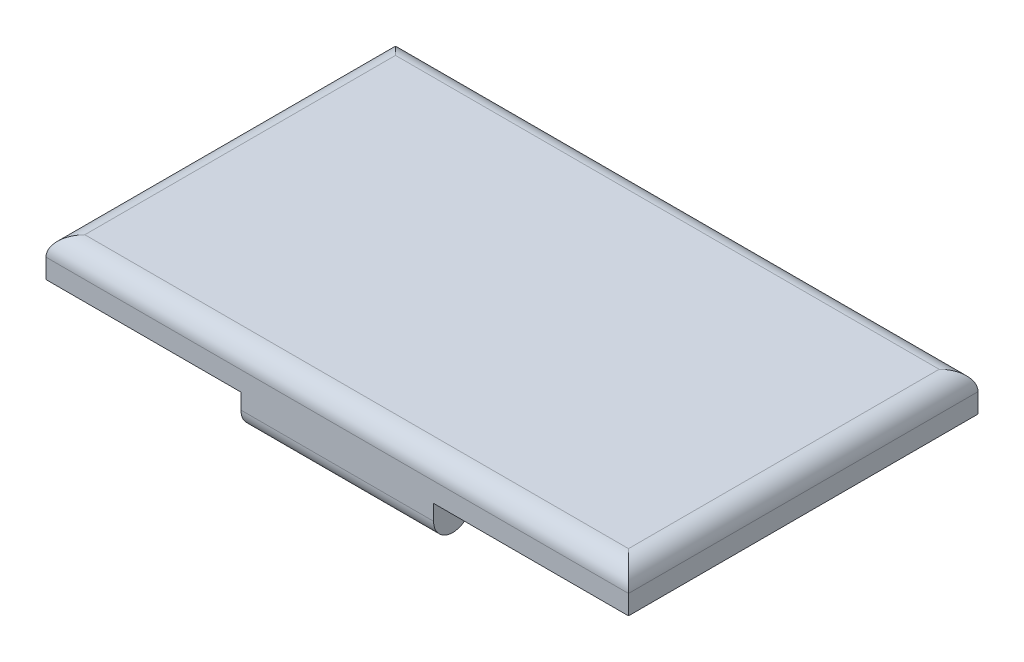
ISO-10303-21;
HEADER;
FILE_DESCRIPTION(('STEP AP214'),'2;1');
FILE_NAME('part.step','',(''),(''),'','','');
FILE_SCHEMA(('AUTOMOTIVE_DESIGN { 1 0 10303 214 1 1 1 1 }'));
ENDSEC;
DATA;
#1=APPLICATION_CONTEXT('core data for automotive mechanical design processes');
#2=APPLICATION_PROTOCOL_DEFINITION('international standard','automotive_design',2000,#1);
#3=PRODUCT_CONTEXT('',#1,'mechanical');
#4=PRODUCT('Part','Part','',(#3));
#5=PRODUCT_RELATED_PRODUCT_CATEGORY('part','',(#4));
#6=PRODUCT_DEFINITION_FORMATION('','',#4);
#7=PRODUCT_DEFINITION_CONTEXT('part definition',#1,'design');
#8=PRODUCT_DEFINITION('design','',#6,#7);
#9=PRODUCT_DEFINITION_SHAPE('','',#8);
#10=(LENGTH_UNIT() NAMED_UNIT(*) SI_UNIT(.MILLI.,.METRE.));
#11=(NAMED_UNIT(*) PLANE_ANGLE_UNIT() SI_UNIT($,.RADIAN.));
#12=(NAMED_UNIT(*) SI_UNIT($,.STERADIAN.) SOLID_ANGLE_UNIT());
#13=UNCERTAINTY_MEASURE_WITH_UNIT(LENGTH_MEASURE(1.E-05),#10,'distance_accuracy_value','');
#14=(GEOMETRIC_REPRESENTATION_CONTEXT(3) GLOBAL_UNCERTAINTY_ASSIGNED_CONTEXT((#13)) GLOBAL_UNIT_ASSIGNED_CONTEXT((#10,
#11,#12)) REPRESENTATION_CONTEXT('',''));
#15=CARTESIAN_POINT('',(0.,0.,0.));
#16=DIRECTION('',(0.,0.,1.));
#17=DIRECTION('',(1.,0.,0.));
#18=AXIS2_PLACEMENT_3D('',#15,#16,#17);
#19=CARTESIAN_POINT('',(0.,0.,0.));
#20=DIRECTION('',(0.,-1.,0.));
#21=DIRECTION('',(0.,0.,-1.));
#22=AXIS2_PLACEMENT_3D('',#19,#20,#21);
#23=PLANE('',#22);
#24=DIRECTION('',(0.,0.,-1.));
#25=VECTOR('',#24,1.);
#26=CARTESIAN_POINT('',(6.,0.,-74.));
#27=LINE('',#26,#25);
#28=CARTESIAN_POINT('',(6.,0.,-16.));
#29=VERTEX_POINT('',#28);
#30=CARTESIAN_POINT('',(6.,0.,-74.));
#31=VERTEX_POINT('',#30);
#32=EDGE_CURVE('E181',#29,#31,#27,.T.);
#33=ORIENTED_EDGE('',*,*,#32,.F.);
#34=DIRECTION('',(-1.,0.,0.));
#35=VECTOR('',#34,1.);
#36=CARTESIAN_POINT('',(6.,0.,-16.));
#37=LINE('',#36,#35);
#38=CARTESIAN_POINT('',(144.,0.,-16.));
#39=VERTEX_POINT('',#38);
#40=EDGE_CURVE('E198',#39,#29,#37,.T.);
#41=ORIENTED_EDGE('',*,*,#40,.F.);
#42=DIRECTION('',(0.,0.,1.));
#43=VECTOR('',#42,1.);
#44=CARTESIAN_POINT('',(144.,0.,-16.));
#45=LINE('',#44,#43);
#46=CARTESIAN_POINT('',(144.,0.,-74.));
#47=VERTEX_POINT('',#46);
#48=EDGE_CURVE('E201',#47,#39,#45,.T.);
#49=ORIENTED_EDGE('',*,*,#48,.F.);
#50=DIRECTION('',(1.,0.,0.));
#51=VECTOR('',#50,1.);
#52=CARTESIAN_POINT('',(144.,0.,-74.));
#53=LINE('',#52,#51);
#54=EDGE_CURVE('E207',#31,#47,#53,.T.);
#55=ORIENTED_EDGE('',*,*,#54,.F.);
#56=EDGE_LOOP('',(#33,#41,#49,#55));
#57=FACE_BOUND('',#56,.T.);
#58=DIRECTION('',(-1.,0.,0.));
#59=VECTOR('',#58,1.);
#60=CARTESIAN_POINT('',(50.2,0.,-80.1));
#61=LINE('',#60,#59);
#62=CARTESIAN_POINT('',(99.8,0.,-80.1));
#63=VERTEX_POINT('',#62);
#64=CARTESIAN_POINT('',(50.2,0.,-80.1));
#65=VERTEX_POINT('',#64);
#66=EDGE_CURVE('E220',#63,#65,#61,.T.);
#67=ORIENTED_EDGE('',*,*,#66,.F.);
#68=DIRECTION('',(0.,0.,1.));
#69=VECTOR('',#68,1.);
#70=CARTESIAN_POINT('',(99.8,0.,-90.));
#71=LINE('',#70,#69);
#72=CARTESIAN_POINT('',(99.8,0.,-90.));
#73=VERTEX_POINT('',#72);
#74=EDGE_CURVE('E214',#73,#63,#71,.T.);
#75=ORIENTED_EDGE('',*,*,#74,.F.);
#76=DIRECTION('',(-1.,0.,0.));
#77=VECTOR('',#76,1.);
#78=CARTESIAN_POINT('',(0.,0.,-90.));
#79=LINE('',#78,#77);
#80=CARTESIAN_POINT('',(150.,0.,-90.));
#81=VERTEX_POINT('',#80);
#82=EDGE_CURVE('E322',#81,#73,#79,.T.);
#83=ORIENTED_EDGE('',*,*,#82,.F.);
#84=DIRECTION('',(0.,0.,-1.));
#85=VECTOR('',#84,1.);
#86=CARTESIAN_POINT('',(150.,0.,0.));
#87=LINE('',#86,#85);
#88=CARTESIAN_POINT('',(150.,0.,0.));
#89=VERTEX_POINT('',#88);
#90=EDGE_CURVE('E336',#89,#81,#87,.T.);
#91=ORIENTED_EDGE('',*,*,#90,.F.);
#92=DIRECTION('',(1.,0.,0.));
#93=VECTOR('',#92,1.);
#94=CARTESIAN_POINT('',(0.,0.,0.));
#95=LINE('',#94,#93);
#96=CARTESIAN_POINT('',(99.8,0.,0.));
#97=VERTEX_POINT('',#96);
#98=EDGE_CURVE('E337',#97,#89,#95,.T.);
#99=ORIENTED_EDGE('',*,*,#98,.F.);
#100=DIRECTION('',(0.,0.,1.));
#101=VECTOR('',#100,1.);
#102=CARTESIAN_POINT('',(99.8,0.,0.));
#103=LINE('',#102,#101);
#104=CARTESIAN_POINT('',(99.8,0.,-9.9));
#105=VERTEX_POINT('',#104);
#106=EDGE_CURVE('E238',#105,#97,#103,.T.);
#107=ORIENTED_EDGE('',*,*,#106,.F.);
#108=DIRECTION('',(1.,0.,0.));
#109=VECTOR('',#108,1.);
#110=CARTESIAN_POINT('',(50.2,0.,-9.90000000000002));
#111=LINE('',#110,#109);
#112=CARTESIAN_POINT('',(50.2,0.,-9.90000000000002));
#113=VERTEX_POINT('',#112);
#114=EDGE_CURVE('E235',#113,#105,#111,.T.);
#115=ORIENTED_EDGE('',*,*,#114,.F.);
#116=DIRECTION('',(0.,0.,-1.));
#117=VECTOR('',#116,1.);
#118=CARTESIAN_POINT('',(50.2,0.,0.));
#119=LINE('',#118,#117);
#120=CARTESIAN_POINT('',(50.2,0.,0.));
#121=VERTEX_POINT('',#120);
#122=EDGE_CURVE('E234',#121,#113,#119,.T.);
#123=ORIENTED_EDGE('',*,*,#122,.F.);
#124=CARTESIAN_POINT('',(0.,0.,0.));
#125=VERTEX_POINT('',#124);
#126=EDGE_CURVE('E332',#125,#121,#95,.T.);
#127=ORIENTED_EDGE('',*,*,#126,.F.);
#128=DIRECTION('',(0.,0.,1.));
#129=VECTOR('',#128,1.);
#130=CARTESIAN_POINT('',(0.,0.,0.));
#131=LINE('',#130,#129);
#132=CARTESIAN_POINT('',(0.,0.,-90.));
#133=VERTEX_POINT('',#132);
#134=EDGE_CURVE('E341',#133,#125,#131,.T.);
#135=ORIENTED_EDGE('',*,*,#134,.F.);
#136=CARTESIAN_POINT('',(50.2,0.,-90.));
#137=VERTEX_POINT('',#136);
#138=EDGE_CURVE('E319',#137,#133,#79,.T.);
#139=ORIENTED_EDGE('',*,*,#138,.F.);
#140=DIRECTION('',(0.,0.,-1.));
#141=VECTOR('',#140,1.);
#142=CARTESIAN_POINT('',(50.2,0.,-90.));
#143=LINE('',#142,#141);
#144=EDGE_CURVE('E223',#65,#137,#143,.T.);
#145=ORIENTED_EDGE('',*,*,#144,.F.);
#146=EDGE_LOOP('',(#67,#75,#83,#91,#99,#107,#115,#123,#127,#135,#139,#145));
#147=FACE_BOUND('',#146,.T.);
#148=ADVANCED_FACE('F33',(#57,#147),#23,.T.);
#149=CARTESIAN_POINT('',(0.,10.,0.));
#150=DIRECTION('',(1.,0.,0.));
#151=DIRECTION('',(0.,0.,-1.));
#152=AXIS2_PLACEMENT_3D('',#149,#150,#151);
#153=PLANE('',#152);
#154=DIRECTION('',(0.,-1.,0.));
#155=VECTOR('',#154,1.);
#156=CARTESIAN_POINT('',(0.,10.,0.));
#157=LINE('',#156,#155);
#158=CARTESIAN_POINT('',(0.,5.,0.));
#159=VERTEX_POINT('',#158);
#160=EDGE_CURVE('E312',#159,#125,#157,.T.);
#161=ORIENTED_EDGE('',*,*,#160,.F.);
#162=DIRECTION('',(0.,0.,1.));
#163=VECTOR('',#162,1.);
#164=CARTESIAN_POINT('',(0.,5.,0.));
#165=LINE('',#164,#163);
#166=CARTESIAN_POINT('',(0.,5.,-90.));
#167=VERTEX_POINT('',#166);
#168=EDGE_CURVE('E11',#159,#167,#165,.F.);
#169=ORIENTED_EDGE('',*,*,#168,.T.);
#170=DIRECTION('',(0.,-1.,0.));
#171=VECTOR('',#170,1.);
#172=CARTESIAN_POINT('',(0.,10.,-90.));
#173=LINE('',#172,#171);
#174=EDGE_CURVE('E310',#167,#133,#173,.T.);
#175=ORIENTED_EDGE('',*,*,#174,.T.);
#176=ORIENTED_EDGE('',*,*,#134,.T.);
#177=EDGE_LOOP('',(#161,#169,#175,#176));
#178=FACE_BOUND('',#177,.T.);
#179=ADVANCED_FACE('F308',(#178),#153,.F.);
#180=CARTESIAN_POINT('',(0.,10.,0.));
#181=DIRECTION('',(0.,0.,-1.));
#182=DIRECTION('',(-1.,0.,0.));
#183=AXIS2_PLACEMENT_3D('',#180,#181,#182);
#184=PLANE('',#183);
#185=DIRECTION('',(0.,1.,0.));
#186=VECTOR('',#185,1.);
#187=CARTESIAN_POINT('',(50.2,-9.,0.));
#188=LINE('',#187,#186);
#189=CARTESIAN_POINT('',(50.2,-4.,0.));
#190=VERTEX_POINT('',#189);
#191=EDGE_CURVE('E247',#190,#121,#188,.T.);
#192=ORIENTED_EDGE('',*,*,#191,.F.);
#193=DIRECTION('',(-1.,0.,0.));
#194=VECTOR('',#193,1.);
#195=CARTESIAN_POINT('',(99.8,-4.,0.));
#196=LINE('',#195,#194);
#197=CARTESIAN_POINT('',(99.8,-4.,0.));
#198=VERTEX_POINT('',#197);
#199=EDGE_CURVE('E274',#190,#198,#196,.F.);
#200=ORIENTED_EDGE('',*,*,#199,.T.);
#201=DIRECTION('',(0.,1.,0.));
#202=VECTOR('',#201,1.);
#203=CARTESIAN_POINT('',(99.8,-9.,0.));
#204=LINE('',#203,#202);
#205=EDGE_CURVE('E255',#198,#97,#204,.T.);
#206=ORIENTED_EDGE('',*,*,#205,.T.);
#207=ORIENTED_EDGE('',*,*,#98,.T.);
#208=DIRECTION('',(0.,-1.,0.));
#209=VECTOR('',#208,1.);
#210=CARTESIAN_POINT('',(150.,10.,0.));
#211=LINE('',#210,#209);
#212=CARTESIAN_POINT('',(150.,5.,0.));
#213=VERTEX_POINT('',#212);
#214=EDGE_CURVE('E324',#213,#89,#211,.T.);
#215=ORIENTED_EDGE('',*,*,#214,.F.);
#216=DIRECTION('',(1.,0.,0.));
#217=VECTOR('',#216,1.);
#218=CARTESIAN_POINT('',(0.,5.,0.));
#219=LINE('',#218,#217);
#220=EDGE_CURVE('E272',#213,#159,#219,.F.);
#221=ORIENTED_EDGE('',*,*,#220,.T.);
#222=ORIENTED_EDGE('',*,*,#160,.T.);
#223=ORIENTED_EDGE('',*,*,#126,.T.);
#224=EDGE_LOOP('',(#192,#200,#206,#207,#215,#221,#222,#223));
#225=FACE_BOUND('',#224,.T.);
#226=ADVANCED_FACE('F414',(#225),#184,.F.);
#227=CARTESIAN_POINT('',(150.,10.,0.));
#228=DIRECTION('',(-1.,0.,0.));
#229=DIRECTION('',(0.,0.,1.));
#230=AXIS2_PLACEMENT_3D('',#227,#228,#229);
#231=PLANE('',#230);
#232=DIRECTION('',(0.,-1.,0.));
#233=VECTOR('',#232,1.);
#234=CARTESIAN_POINT('',(150.,10.,-90.));
#235=LINE('',#234,#233);
#236=CARTESIAN_POINT('',(150.,5.,-90.));
#237=VERTEX_POINT('',#236);
#238=EDGE_CURVE('E321',#237,#81,#235,.T.);
#239=ORIENTED_EDGE('',*,*,#238,.F.);
#240=DIRECTION('',(0.,0.,-1.));
#241=VECTOR('',#240,1.);
#242=CARTESIAN_POINT('',(150.,5.,0.));
#243=LINE('',#242,#241);
#244=EDGE_CURVE('E42',#237,#213,#243,.F.);
#245=ORIENTED_EDGE('',*,*,#244,.T.);
#246=ORIENTED_EDGE('',*,*,#214,.T.);
#247=ORIENTED_EDGE('',*,*,#90,.T.);
#248=EDGE_LOOP('',(#239,#245,#246,#247));
#249=FACE_BOUND('',#248,.T.);
#250=ADVANCED_FACE('F347',(#249),#231,.F.);
#251=CARTESIAN_POINT('',(0.,10.,-90.));
#252=DIRECTION('',(0.,0.,1.));
#253=DIRECTION('',(1.,0.,0.));
#254=AXIS2_PLACEMENT_3D('',#251,#252,#253);
#255=PLANE('',#254);
#256=DIRECTION('',(0.,1.,0.));
#257=VECTOR('',#256,1.);
#258=CARTESIAN_POINT('',(99.8,-9.,-90.));
#259=LINE('',#258,#257);
#260=CARTESIAN_POINT('',(99.8,-4.,-90.));
#261=VERTEX_POINT('',#260);
#262=EDGE_CURVE('E232',#261,#73,#259,.T.);
#263=ORIENTED_EDGE('',*,*,#262,.F.);
#264=DIRECTION('',(1.,0.,0.));
#265=VECTOR('',#264,1.);
#266=CARTESIAN_POINT('',(50.2,-4.,-90.));
#267=LINE('',#266,#265);
#268=CARTESIAN_POINT('',(50.2,-4.,-90.));
#269=VERTEX_POINT('',#268);
#270=EDGE_CURVE('E258',#261,#269,#267,.F.);
#271=ORIENTED_EDGE('',*,*,#270,.T.);
#272=DIRECTION('',(0.,1.,0.));
#273=VECTOR('',#272,1.);
#274=CARTESIAN_POINT('',(50.2,-9.,-90.));
#275=LINE('',#274,#273);
#276=EDGE_CURVE('E226',#269,#137,#275,.T.);
#277=ORIENTED_EDGE('',*,*,#276,.T.);
#278=ORIENTED_EDGE('',*,*,#138,.T.);
#279=ORIENTED_EDGE('',*,*,#174,.F.);
#280=DIRECTION('',(-1.,0.,0.));
#281=VECTOR('',#280,1.);
#282=CARTESIAN_POINT('',(0.,5.,-90.));
#283=LINE('',#282,#281);
#284=EDGE_CURVE('E316',#167,#237,#283,.F.);
#285=ORIENTED_EDGE('',*,*,#284,.T.);
#286=ORIENTED_EDGE('',*,*,#238,.T.);
#287=ORIENTED_EDGE('',*,*,#82,.T.);
#288=EDGE_LOOP('',(#263,#271,#277,#278,#279,#285,#286,#287));
#289=FACE_BOUND('',#288,.T.);
#290=ADVANCED_FACE('F315',(#289),#255,.F.);
#291=CARTESIAN_POINT('',(0.,10.,0.));
#292=DIRECTION('',(0.,-1.,0.));
#293=DIRECTION('',(0.,0.,-1.));
#294=AXIS2_PLACEMENT_3D('',#291,#292,#293);
#295=PLANE('',#294);
#296=DIRECTION('',(1.,0.,0.));
#297=VECTOR('',#296,1.);
#298=CARTESIAN_POINT('',(0.,10.,-5.));
#299=LINE('',#298,#297);
#300=CARTESIAN_POINT('',(5.,10.,-5.));
#301=VERTEX_POINT('',#300);
#302=CARTESIAN_POINT('',(145.,10.,-5.));
#303=VERTEX_POINT('',#302);
#304=EDGE_CURVE('E58',#301,#303,#299,.T.);
#305=ORIENTED_EDGE('',*,*,#304,.T.);
#306=DIRECTION('',(0.,0.,-1.));
#307=VECTOR('',#306,1.);
#308=CARTESIAN_POINT('',(145.,10.,0.));
#309=LINE('',#308,#307);
#310=CARTESIAN_POINT('',(145.,10.,-85.));
#311=VERTEX_POINT('',#310);
#312=EDGE_CURVE('E281',#303,#311,#309,.T.);
#313=ORIENTED_EDGE('',*,*,#312,.T.);
#314=DIRECTION('',(-1.,0.,0.));
#315=VECTOR('',#314,1.);
#316=CARTESIAN_POINT('',(0.,10.,-85.));
#317=LINE('',#316,#315);
#318=CARTESIAN_POINT('',(5.,10.,-85.));
#319=VERTEX_POINT('',#318);
#320=EDGE_CURVE('E279',#311,#319,#317,.T.);
#321=ORIENTED_EDGE('',*,*,#320,.T.);
#322=DIRECTION('',(0.,0.,1.));
#323=VECTOR('',#322,1.);
#324=CARTESIAN_POINT('',(5.,10.,0.));
#325=LINE('',#324,#323);
#326=EDGE_CURVE('E276',#319,#301,#325,.T.);
#327=ORIENTED_EDGE('',*,*,#326,.T.);
#328=EDGE_LOOP('',(#305,#313,#321,#327));
#329=FACE_BOUND('',#328,.T.);
#330=ADVANCED_FACE('F405',(#329),#295,.F.);
#331=CARTESIAN_POINT('',(50.2,-9.,0.));
#332=DIRECTION('',(1.,0.,0.));
#333=DIRECTION('',(0.,0.,-1.));
#334=AXIS2_PLACEMENT_3D('',#331,#332,#333);
#335=PLANE('',#334);
#336=DIRECTION('',(0.,1.,0.));
#337=VECTOR('',#336,1.);
#338=CARTESIAN_POINT('',(50.2,-9.,-9.90000000000002));
#339=LINE('',#338,#337);
#340=CARTESIAN_POINT('',(50.2,-4.,-9.90000000000002));
#341=VERTEX_POINT('',#340);
#342=EDGE_CURVE('E384',#341,#113,#339,.T.);
#343=ORIENTED_EDGE('',*,*,#342,.F.);
#344=CARTESIAN_POINT('',(50.2,-4.,-4.90000000000002));
#345=DIRECTION('',(1.,0.,0.));
#346=DIRECTION('',(0.,0.,-1.));
#347=AXIS2_PLACEMENT_3D('',#344,#345,#346);
#348=CIRCLE('',#347,5.);
#349=CARTESIAN_POINT('',(50.2,-8.99974999374969,-4.95000000000001));
#350=VERTEX_POINT('',#349);
#351=EDGE_CURVE('E270',#341,#350,#348,.F.);
#352=ORIENTED_EDGE('',*,*,#351,.T.);
#353=CARTESIAN_POINT('',(50.2,-4.,-5.));
#354=DIRECTION('',(1.,0.,0.));
#355=DIRECTION('',(0.,0.,-1.));
#356=AXIS2_PLACEMENT_3D('',#353,#354,#355);
#357=CIRCLE('',#356,5.);
#358=EDGE_CURVE('E267',#350,#190,#357,.F.);
#359=ORIENTED_EDGE('',*,*,#358,.T.);
#360=ORIENTED_EDGE('',*,*,#191,.T.);
#361=ORIENTED_EDGE('',*,*,#122,.T.);
#362=EDGE_LOOP('',(#343,#352,#359,#360,#361));
#363=FACE_BOUND('',#362,.T.);
#364=ADVANCED_FACE('F398',(#363),#335,.F.);
#365=CARTESIAN_POINT('',(50.2,-9.,-9.90000000000002));
#366=DIRECTION('',(0.,0.,1.));
#367=DIRECTION('',(1.,0.,0.));
#368=AXIS2_PLACEMENT_3D('',#365,#366,#367);
#369=PLANE('',#368);
#370=DIRECTION('',(0.,1.,0.));
#371=VECTOR('',#370,1.);
#372=CARTESIAN_POINT('',(99.8,-9.,-9.9));
#373=LINE('',#372,#371);
#374=CARTESIAN_POINT('',(99.8,-4.,-9.9));
#375=VERTEX_POINT('',#374);
#376=EDGE_CURVE('E241',#375,#105,#373,.T.);
#377=ORIENTED_EDGE('',*,*,#376,.F.);
#378=DIRECTION('',(1.,0.,0.));
#379=VECTOR('',#378,1.);
#380=CARTESIAN_POINT('',(50.2,-4.,-9.90000000000002));
#381=LINE('',#380,#379);
#382=EDGE_CURVE('E264',#375,#341,#381,.F.);
#383=ORIENTED_EDGE('',*,*,#382,.T.);
#384=ORIENTED_EDGE('',*,*,#342,.T.);
#385=ORIENTED_EDGE('',*,*,#114,.T.);
#386=EDGE_LOOP('',(#377,#383,#384,#385));
#387=FACE_BOUND('',#386,.T.);
#388=ADVANCED_FACE('F396',(#387),#369,.F.);
#389=CARTESIAN_POINT('',(99.8,-9.,0.));
#390=DIRECTION('',(-1.,0.,0.));
#391=DIRECTION('',(0.,0.,1.));
#392=AXIS2_PLACEMENT_3D('',#389,#390,#391);
#393=PLANE('',#392);
#394=CARTESIAN_POINT('',(99.8,-4.,-5.));
#395=DIRECTION('',(-1.,0.,0.));
#396=DIRECTION('',(0.,0.,1.));
#397=AXIS2_PLACEMENT_3D('',#394,#395,#396);
#398=CIRCLE('',#397,5.);
#399=CARTESIAN_POINT('',(99.8,-8.99974999374969,-4.95));
#400=VERTEX_POINT('',#399);
#401=EDGE_CURVE('E260',#198,#400,#398,.F.);
#402=ORIENTED_EDGE('',*,*,#401,.T.);
#403=CARTESIAN_POINT('',(99.8,-4.,-4.9));
#404=DIRECTION('',(-1.,0.,0.));
#405=DIRECTION('',(0.,0.,1.));
#406=AXIS2_PLACEMENT_3D('',#403,#404,#405);
#407=CIRCLE('',#406,5.);
#408=EDGE_CURVE('E262',#400,#375,#407,.F.);
#409=ORIENTED_EDGE('',*,*,#408,.T.);
#410=ORIENTED_EDGE('',*,*,#376,.T.);
#411=ORIENTED_EDGE('',*,*,#106,.T.);
#412=ORIENTED_EDGE('',*,*,#205,.F.);
#413=EDGE_LOOP('',(#402,#409,#410,#411,#412));
#414=FACE_BOUND('',#413,.T.);
#415=ADVANCED_FACE('F391',(#414),#393,.F.);
#416=CARTESIAN_POINT('',(99.8,-9.,-90.));
#417=DIRECTION('',(-1.,0.,0.));
#418=DIRECTION('',(0.,0.,1.));
#419=AXIS2_PLACEMENT_3D('',#416,#417,#418);
#420=PLANE('',#419);
#421=DIRECTION('',(0.,1.,0.));
#422=VECTOR('',#421,1.);
#423=CARTESIAN_POINT('',(99.8,-9.,-80.1));
#424=LINE('',#423,#422);
#425=CARTESIAN_POINT('',(99.8,-4.,-80.1));
#426=VERTEX_POINT('',#425);
#427=EDGE_CURVE('E230',#426,#63,#424,.T.);
#428=ORIENTED_EDGE('',*,*,#427,.F.);
#429=CARTESIAN_POINT('',(99.8,-4.,-85.1));
#430=DIRECTION('',(-1.,0.,0.));
#431=DIRECTION('',(0.,0.,1.));
#432=AXIS2_PLACEMENT_3D('',#429,#430,#431);
#433=CIRCLE('',#432,5.);
#434=CARTESIAN_POINT('',(99.8,-8.99974999374969,-85.05));
#435=VERTEX_POINT('',#434);
#436=EDGE_CURVE('E363',#426,#435,#433,.F.);
#437=ORIENTED_EDGE('',*,*,#436,.T.);
#438=CARTESIAN_POINT('',(99.8,-4.,-85.));
#439=DIRECTION('',(-1.,0.,0.));
#440=DIRECTION('',(0.,0.,1.));
#441=AXIS2_PLACEMENT_3D('',#438,#439,#440);
#442=CIRCLE('',#441,5.);
#443=EDGE_CURVE('E362',#435,#261,#442,.F.);
#444=ORIENTED_EDGE('',*,*,#443,.T.);
#445=ORIENTED_EDGE('',*,*,#262,.T.);
#446=ORIENTED_EDGE('',*,*,#74,.T.);
#447=EDGE_LOOP('',(#428,#437,#444,#445,#446));
#448=FACE_BOUND('',#447,.T.);
#449=ADVANCED_FACE('F380',(#448),#420,.F.);
#450=CARTESIAN_POINT('',(50.2,-9.,-80.1));
#451=DIRECTION('',(0.,0.,-1.));
#452=DIRECTION('',(-1.,0.,0.));
#453=AXIS2_PLACEMENT_3D('',#450,#451,#452);
#454=PLANE('',#453);
#455=DIRECTION('',(0.,1.,0.));
#456=VECTOR('',#455,1.);
#457=CARTESIAN_POINT('',(50.2,-9.,-80.1));
#458=LINE('',#457,#456);
#459=CARTESIAN_POINT('',(50.2,-4.,-80.1));
#460=VERTEX_POINT('',#459);
#461=EDGE_CURVE('E228',#460,#65,#458,.T.);
#462=ORIENTED_EDGE('',*,*,#461,.F.);
#463=DIRECTION('',(-1.,0.,0.));
#464=VECTOR('',#463,1.);
#465=CARTESIAN_POINT('',(99.8,-4.,-80.1));
#466=LINE('',#465,#464);
#467=EDGE_CURVE('E367',#460,#426,#466,.F.);
#468=ORIENTED_EDGE('',*,*,#467,.T.);
#469=ORIENTED_EDGE('',*,*,#427,.T.);
#470=ORIENTED_EDGE('',*,*,#66,.T.);
#471=EDGE_LOOP('',(#462,#468,#469,#470));
#472=FACE_BOUND('',#471,.T.);
#473=ADVANCED_FACE('F379',(#472),#454,.F.);
#474=CARTESIAN_POINT('',(50.2,-9.,-90.));
#475=DIRECTION('',(1.,0.,0.));
#476=DIRECTION('',(0.,0.,-1.));
#477=AXIS2_PLACEMENT_3D('',#474,#475,#476);
#478=PLANE('',#477);
#479=CARTESIAN_POINT('',(50.2,-4.,-85.));
#480=DIRECTION('',(1.,0.,0.));
#481=DIRECTION('',(0.,0.,-1.));
#482=AXIS2_PLACEMENT_3D('',#479,#480,#481);
#483=CIRCLE('',#482,5.);
#484=CARTESIAN_POINT('',(50.2,-8.99974999374969,-85.05));
#485=VERTEX_POINT('',#484);
#486=EDGE_CURVE('E252',#269,#485,#483,.F.);
#487=ORIENTED_EDGE('',*,*,#486,.T.);
#488=CARTESIAN_POINT('',(50.2,-4.,-85.1));
#489=DIRECTION('',(1.,0.,0.));
#490=DIRECTION('',(0.,0.,-1.));
#491=AXIS2_PLACEMENT_3D('',#488,#489,#490);
#492=CIRCLE('',#491,5.);
#493=EDGE_CURVE('E369',#485,#460,#492,.F.);
#494=ORIENTED_EDGE('',*,*,#493,.T.);
#495=ORIENTED_EDGE('',*,*,#461,.T.);
#496=ORIENTED_EDGE('',*,*,#144,.T.);
#497=ORIENTED_EDGE('',*,*,#276,.F.);
#498=EDGE_LOOP('',(#487,#494,#495,#496,#497));
#499=FACE_BOUND('',#498,.T.);
#500=ADVANCED_FACE('F373',(#499),#478,.F.);
#501=CARTESIAN_POINT('',(6.,7.,-74.));
#502=DIRECTION('',(-1.,0.,0.));
#503=DIRECTION('',(0.,0.,1.));
#504=AXIS2_PLACEMENT_3D('',#501,#502,#503);
#505=PLANE('',#504);
#506=ORIENTED_EDGE('',*,*,#32,.T.);
#507=DIRECTION('',(0.,-1.,0.));
#508=VECTOR('',#507,1.);
#509=CARTESIAN_POINT('',(6.,7.,-74.));
#510=LINE('',#509,#508);
#511=CARTESIAN_POINT('',(6.,7.,-74.));
#512=VERTEX_POINT('',#511);
#513=EDGE_CURVE('E174',#512,#31,#510,.T.);
#514=ORIENTED_EDGE('',*,*,#513,.F.);
#515=DIRECTION('',(0.,0.,-1.));
#516=VECTOR('',#515,1.);
#517=CARTESIAN_POINT('',(6.,7.,-74.));
#518=LINE('',#517,#516);
#519=CARTESIAN_POINT('',(6.,7.,-16.));
#520=VERTEX_POINT('',#519);
#521=EDGE_CURVE('E178',#520,#512,#518,.T.);
#522=ORIENTED_EDGE('',*,*,#521,.F.);
#523=DIRECTION('',(0.,-1.,0.));
#524=VECTOR('',#523,1.);
#525=CARTESIAN_POINT('',(6.,7.,-16.));
#526=LINE('',#525,#524);
#527=EDGE_CURVE('E212',#520,#29,#526,.T.);
#528=ORIENTED_EDGE('',*,*,#527,.T.);
#529=EDGE_LOOP('',(#506,#514,#522,#528));
#530=FACE_BOUND('',#529,.T.);
#531=ADVANCED_FACE('F176',(#530),#505,.F.);
#532=CARTESIAN_POINT('',(6.,7.,-16.));
#533=DIRECTION('',(0.,0.,1.));
#534=DIRECTION('',(1.,0.,0.));
#535=AXIS2_PLACEMENT_3D('',#532,#533,#534);
#536=PLANE('',#535);
#537=ORIENTED_EDGE('',*,*,#40,.T.);
#538=ORIENTED_EDGE('',*,*,#527,.F.);
#539=DIRECTION('',(-1.,0.,0.));
#540=VECTOR('',#539,1.);
#541=CARTESIAN_POINT('',(6.,7.,-16.));
#542=LINE('',#541,#540);
#543=CARTESIAN_POINT('',(144.,7.,-16.));
#544=VERTEX_POINT('',#543);
#545=EDGE_CURVE('E186',#544,#520,#542,.T.);
#546=ORIENTED_EDGE('',*,*,#545,.F.);
#547=DIRECTION('',(0.,-1.,0.));
#548=VECTOR('',#547,1.);
#549=CARTESIAN_POINT('',(144.,7.,-16.));
#550=LINE('',#549,#548);
#551=EDGE_CURVE('E215',#544,#39,#550,.T.);
#552=ORIENTED_EDGE('',*,*,#551,.T.);
#553=EDGE_LOOP('',(#537,#538,#546,#552));
#554=FACE_BOUND('',#553,.T.);
#555=ADVANCED_FACE('F485',(#554),#536,.F.);
#556=CARTESIAN_POINT('',(144.,7.,-16.));
#557=DIRECTION('',(1.,0.,0.));
#558=DIRECTION('',(0.,0.,-1.));
#559=AXIS2_PLACEMENT_3D('',#556,#557,#558);
#560=PLANE('',#559);
#561=ORIENTED_EDGE('',*,*,#48,.T.);
#562=ORIENTED_EDGE('',*,*,#551,.F.);
#563=DIRECTION('',(0.,0.,1.));
#564=VECTOR('',#563,1.);
#565=CARTESIAN_POINT('',(144.,7.,-16.));
#566=LINE('',#565,#564);
#567=CARTESIAN_POINT('',(144.,7.,-74.));
#568=VERTEX_POINT('',#567);
#569=EDGE_CURVE('E194',#568,#544,#566,.T.);
#570=ORIENTED_EDGE('',*,*,#569,.F.);
#571=DIRECTION('',(0.,-1.,0.));
#572=VECTOR('',#571,1.);
#573=CARTESIAN_POINT('',(144.,7.,-74.));
#574=LINE('',#573,#572);
#575=EDGE_CURVE('E185',#568,#47,#574,.T.);
#576=ORIENTED_EDGE('',*,*,#575,.T.);
#577=EDGE_LOOP('',(#561,#562,#570,#576));
#578=FACE_BOUND('',#577,.T.);
#579=ADVANCED_FACE('F478',(#578),#560,.F.);
#580=CARTESIAN_POINT('',(144.,7.,-74.));
#581=DIRECTION('',(0.,0.,-1.));
#582=DIRECTION('',(-1.,0.,0.));
#583=AXIS2_PLACEMENT_3D('',#580,#581,#582);
#584=PLANE('',#583);
#585=ORIENTED_EDGE('',*,*,#54,.T.);
#586=ORIENTED_EDGE('',*,*,#575,.F.);
#587=DIRECTION('',(1.,0.,0.));
#588=VECTOR('',#587,1.);
#589=CARTESIAN_POINT('',(144.,7.,-74.));
#590=LINE('',#589,#588);
#591=EDGE_CURVE('E189',#512,#568,#590,.T.);
#592=ORIENTED_EDGE('',*,*,#591,.F.);
#593=ORIENTED_EDGE('',*,*,#513,.T.);
#594=EDGE_LOOP('',(#585,#586,#592,#593));
#595=FACE_BOUND('',#594,.T.);
#596=ADVANCED_FACE('F190',(#595),#584,.F.);
#597=CARTESIAN_POINT('',(0.,7.,0.));
#598=DIRECTION('',(0.,1.,0.));
#599=DIRECTION('',(0.,0.,1.));
#600=AXIS2_PLACEMENT_3D('',#597,#598,#599);
#601=PLANE('',#600);
#602=ORIENTED_EDGE('',*,*,#521,.T.);
#603=ORIENTED_EDGE('',*,*,#591,.T.);
#604=ORIENTED_EDGE('',*,*,#569,.T.);
#605=ORIENTED_EDGE('',*,*,#545,.T.);
#606=EDGE_LOOP('',(#602,#603,#604,#605));
#607=FACE_BOUND('',#606,.T.);
#608=ADVANCED_FACE('F196',(#607),#601,.F.);
#609=CARTESIAN_POINT('',(0.,-4.,-85.));
#610=DIRECTION('',(-1.,0.,0.));
#611=DIRECTION('',(0.,0.,1.));
#612=AXIS2_PLACEMENT_3D('',#609,#610,#611);
#613=CYLINDRICAL_SURFACE('',#612,5.);
#614=ORIENTED_EDGE('',*,*,#270,.F.);
#615=ORIENTED_EDGE('',*,*,#443,.F.);
#616=DIRECTION('',(-1.,0.,0.));
#617=VECTOR('',#616,1.);
#618=CARTESIAN_POINT('',(75.,-8.99974999374969,-85.05));
#619=LINE('',#618,#617);
#620=EDGE_CURVE('E208',#485,#435,#619,.F.);
#621=ORIENTED_EDGE('',*,*,#620,.F.);
#622=ORIENTED_EDGE('',*,*,#486,.F.);
#623=EDGE_LOOP('',(#614,#615,#621,#622));
#624=FACE_BOUND('',#623,.T.);
#625=ADVANCED_FACE('F360',(#624),#613,.T.);
#626=CARTESIAN_POINT('',(0.,-4.,-85.1));
#627=DIRECTION('',(1.,0.,0.));
#628=DIRECTION('',(0.,0.,-1.));
#629=AXIS2_PLACEMENT_3D('',#626,#627,#628);
#630=CYLINDRICAL_SURFACE('',#629,5.);
#631=ORIENTED_EDGE('',*,*,#436,.F.);
#632=ORIENTED_EDGE('',*,*,#467,.F.);
#633=ORIENTED_EDGE('',*,*,#493,.F.);
#634=ORIENTED_EDGE('',*,*,#620,.T.);
#635=EDGE_LOOP('',(#631,#632,#633,#634));
#636=FACE_BOUND('',#635,.T.);
#637=ADVANCED_FACE('F376',(#636),#630,.T.);
#638=CARTESIAN_POINT('',(0.,-4.,-5.));
#639=DIRECTION('',(1.,0.,0.));
#640=DIRECTION('',(0.,0.,-1.));
#641=AXIS2_PLACEMENT_3D('',#638,#639,#640);
#642=CYLINDRICAL_SURFACE('',#641,5.);
#643=ORIENTED_EDGE('',*,*,#199,.F.);
#644=ORIENTED_EDGE('',*,*,#358,.F.);
#645=DIRECTION('',(1.,0.,0.));
#646=VECTOR('',#645,1.);
#647=CARTESIAN_POINT('',(75.,-8.99974999374969,-4.95));
#648=LINE('',#647,#646);
#649=EDGE_CURVE('E287',#400,#350,#648,.F.);
#650=ORIENTED_EDGE('',*,*,#649,.F.);
#651=ORIENTED_EDGE('',*,*,#401,.F.);
#652=EDGE_LOOP('',(#643,#644,#650,#651));
#653=FACE_BOUND('',#652,.T.);
#654=ADVANCED_FACE('F427',(#653),#642,.T.);
#655=CARTESIAN_POINT('',(0.,-4.,-4.90000000000004));
#656=DIRECTION('',(-1.,0.,0.));
#657=DIRECTION('',(0.,0.,1.));
#658=AXIS2_PLACEMENT_3D('',#655,#656,#657);
#659=CYLINDRICAL_SURFACE('',#658,5.);
#660=ORIENTED_EDGE('',*,*,#351,.F.);
#661=ORIENTED_EDGE('',*,*,#382,.F.);
#662=ORIENTED_EDGE('',*,*,#408,.F.);
#663=ORIENTED_EDGE('',*,*,#649,.T.);
#664=EDGE_LOOP('',(#660,#661,#662,#663));
#665=FACE_BOUND('',#664,.T.);
#666=ADVANCED_FACE('F430',(#665),#659,.T.);
#667=CARTESIAN_POINT('',(5.,5.,0.));
#668=DIRECTION('',(0.,0.,1.));
#669=DIRECTION('',(1.,0.,0.));
#670=AXIS2_PLACEMENT_3D('',#667,#668,#669);
#671=CYLINDRICAL_SURFACE('',#670,5.);
#672=CARTESIAN_POINT('',(5.,5.,-85.));
#673=DIRECTION('',(-0.707106781186547,0.,0.707106781186547));
#674=DIRECTION('',(0.707106781186547,0.,0.707106781186547));
#675=AXIS2_PLACEMENT_3D('',#672,#673,#674);
#676=ELLIPSE('',#675,7.07106781186547,5.);
#677=EDGE_CURVE('E292',#167,#319,#676,.F.);
#678=ORIENTED_EDGE('',*,*,#677,.F.);
#679=ORIENTED_EDGE('',*,*,#168,.F.);
#680=CARTESIAN_POINT('',(5.,5.,-5.));
#681=DIRECTION('',(0.707106781186547,0.,0.707106781186547));
#682=DIRECTION('',(-0.707106781186547,0.,0.707106781186547));
#683=AXIS2_PLACEMENT_3D('',#680,#681,#682);
#684=ELLIPSE('',#683,7.07106781186547,5.);
#685=EDGE_CURVE('E37',#301,#159,#684,.T.);
#686=ORIENTED_EDGE('',*,*,#685,.F.);
#687=ORIENTED_EDGE('',*,*,#326,.F.);
#688=EDGE_LOOP('',(#678,#679,#686,#687));
#689=FACE_BOUND('',#688,.T.);
#690=ADVANCED_FACE('F35',(#689),#671,.T.);
#691=CARTESIAN_POINT('',(0.,5.,-5.));
#692=DIRECTION('',(1.,0.,0.));
#693=DIRECTION('',(0.,0.,-1.));
#694=AXIS2_PLACEMENT_3D('',#691,#692,#693);
#695=CYLINDRICAL_SURFACE('',#694,5.);
#696=ORIENTED_EDGE('',*,*,#685,.T.);
#697=ORIENTED_EDGE('',*,*,#220,.F.);
#698=CARTESIAN_POINT('',(145.,5.,-5.));
#699=DIRECTION('',(0.707106781186547,0.,-0.707106781186547));
#700=DIRECTION('',(0.707106781186547,0.,0.707106781186547));
#701=AXIS2_PLACEMENT_3D('',#698,#699,#700);
#702=ELLIPSE('',#701,7.07106781186547,5.);
#703=EDGE_CURVE('E291',#303,#213,#702,.T.);
#704=ORIENTED_EDGE('',*,*,#703,.F.);
#705=ORIENTED_EDGE('',*,*,#304,.F.);
#706=EDGE_LOOP('',(#696,#697,#704,#705));
#707=FACE_BOUND('',#706,.T.);
#708=ADVANCED_FACE('F301',(#707),#695,.T.);
#709=CARTESIAN_POINT('',(0.,5.,-85.));
#710=DIRECTION('',(-1.,0.,0.));
#711=DIRECTION('',(0.,0.,1.));
#712=AXIS2_PLACEMENT_3D('',#709,#710,#711);
#713=CYLINDRICAL_SURFACE('',#712,5.);
#714=ORIENTED_EDGE('',*,*,#677,.T.);
#715=ORIENTED_EDGE('',*,*,#320,.F.);
#716=CARTESIAN_POINT('',(145.,5.,-85.));
#717=DIRECTION('',(-0.707106781186547,0.,-0.707106781186547));
#718=DIRECTION('',(-0.707106781186547,0.,0.707106781186547));
#719=AXIS2_PLACEMENT_3D('',#716,#717,#718);
#720=ELLIPSE('',#719,7.07106781186547,5.);
#721=EDGE_CURVE('E50',#237,#311,#720,.F.);
#722=ORIENTED_EDGE('',*,*,#721,.F.);
#723=ORIENTED_EDGE('',*,*,#284,.F.);
#724=EDGE_LOOP('',(#714,#715,#722,#723));
#725=FACE_BOUND('',#724,.T.);
#726=ADVANCED_FACE('F440',(#725),#713,.T.);
#727=CARTESIAN_POINT('',(145.,5.,0.));
#728=DIRECTION('',(0.,0.,-1.));
#729=DIRECTION('',(-1.,0.,0.));
#730=AXIS2_PLACEMENT_3D('',#727,#728,#729);
#731=CYLINDRICAL_SURFACE('',#730,5.);
#732=ORIENTED_EDGE('',*,*,#703,.T.);
#733=ORIENTED_EDGE('',*,*,#244,.F.);
#734=ORIENTED_EDGE('',*,*,#721,.T.);
#735=ORIENTED_EDGE('',*,*,#312,.F.);
#736=EDGE_LOOP('',(#732,#733,#734,#735));
#737=FACE_BOUND('',#736,.T.);
#738=ADVANCED_FACE('F437',(#737),#731,.T.);
#739=CLOSED_SHELL('',(#148,#179,#226,#250,#290,#330,#364,#388,#415,#449,#473,#500,#531,#555,
#579,#596,#608,#625,#637,#654,#666,#690,#708,#726,#738));
#740=MANIFOLD_SOLID_BREP('B2',#739);
#741=ADVANCED_BREP_SHAPE_REPRESENTATION('',(#18,#740),#14);
#742=SHAPE_DEFINITION_REPRESENTATION(#9,#741);
ENDSEC;
END-ISO-10303-21;
